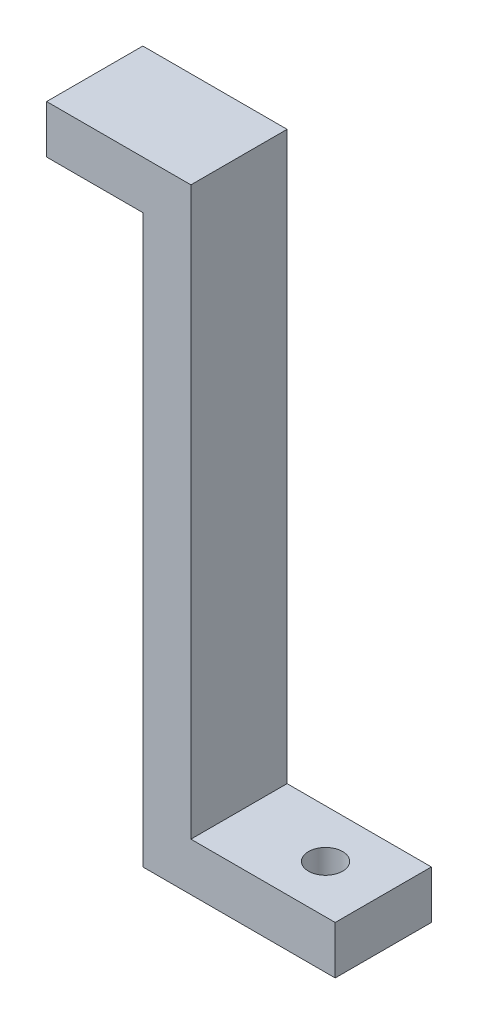
ISO-10303-21;
HEADER;
FILE_DESCRIPTION(('STEP AP214'),'2;1');
FILE_NAME('part.step','',(''),(''),'','','');
FILE_SCHEMA(('AUTOMOTIVE_DESIGN { 1 0 10303 214 1 1 1 1 }'));
ENDSEC;
DATA;
#1=APPLICATION_CONTEXT('core data for automotive mechanical design processes');
#2=APPLICATION_PROTOCOL_DEFINITION('international standard','automotive_design',2000,#1);
#3=PRODUCT_CONTEXT('',#1,'mechanical');
#4=PRODUCT('Part','Part','',(#3));
#5=PRODUCT_RELATED_PRODUCT_CATEGORY('part','',(#4));
#6=PRODUCT_DEFINITION_FORMATION('','',#4);
#7=PRODUCT_DEFINITION_CONTEXT('part definition',#1,'design');
#8=PRODUCT_DEFINITION('design','',#6,#7);
#9=PRODUCT_DEFINITION_SHAPE('','',#8);
#10=(LENGTH_UNIT() NAMED_UNIT(*) SI_UNIT(.MILLI.,.METRE.));
#11=(NAMED_UNIT(*) PLANE_ANGLE_UNIT() SI_UNIT($,.RADIAN.));
#12=(NAMED_UNIT(*) SI_UNIT($,.STERADIAN.) SOLID_ANGLE_UNIT());
#13=UNCERTAINTY_MEASURE_WITH_UNIT(LENGTH_MEASURE(1.E-05),#10,'distance_accuracy_value','');
#14=(GEOMETRIC_REPRESENTATION_CONTEXT(3) GLOBAL_UNCERTAINTY_ASSIGNED_CONTEXT((#13)) GLOBAL_UNIT_ASSIGNED_CONTEXT((#10,
#11,#12)) REPRESENTATION_CONTEXT('',''));
#15=CARTESIAN_POINT('',(0.,0.,0.));
#16=DIRECTION('',(0.,0.,1.));
#17=DIRECTION('',(1.,0.,0.));
#18=AXIS2_PLACEMENT_3D('',#15,#16,#17);
#19=CARTESIAN_POINT('',(-20.,0.,10.));
#20=DIRECTION('',(0.,1.,0.));
#21=DIRECTION('',(0.,0.,1.));
#22=AXIS2_PLACEMENT_3D('',#19,#20,#21);
#23=PLANE('',#22);
#24=CARTESIAN_POINT('',(-6.,0.,5.));
#25=DIRECTION('',(0.,1.,0.));
#26=DIRECTION('',(-1.,0.,0.));
#27=AXIS2_PLACEMENT_3D('',#24,#25,#26);
#28=CIRCLE('',#27,1.775);
#29=CARTESIAN_POINT('',(-7.775,0.,5.));
#30=VERTEX_POINT('',#29);
#31=EDGE_CURVE('E133',#30,#30,#28,.T.);
#32=ORIENTED_EDGE('',*,*,#31,.T.);
#33=EDGE_LOOP('',(#32));
#34=FACE_BOUND('',#33,.T.);
#35=DIRECTION('',(1.,0.,0.));
#36=VECTOR('',#35,1.);
#37=CARTESIAN_POINT('',(-20.,0.,0.));
#38=LINE('',#37,#36);
#39=CARTESIAN_POINT('',(-20.,0.,0.));
#40=VERTEX_POINT('',#39);
#41=CARTESIAN_POINT('',(0.,0.,0.));
#42=VERTEX_POINT('',#41);
#43=EDGE_CURVE('E129',#40,#42,#38,.T.);
#44=ORIENTED_EDGE('',*,*,#43,.T.);
#45=DIRECTION('',(0.,0.,-1.));
#46=VECTOR('',#45,1.);
#47=CARTESIAN_POINT('',(0.,0.,10.));
#48=LINE('',#47,#46);
#49=CARTESIAN_POINT('',(0.,0.,10.));
#50=VERTEX_POINT('',#49);
#51=EDGE_CURVE('E11',#50,#42,#48,.T.);
#52=ORIENTED_EDGE('',*,*,#51,.F.);
#53=DIRECTION('',(1.,0.,0.));
#54=VECTOR('',#53,1.);
#55=CARTESIAN_POINT('',(-20.,0.,10.));
#56=LINE('',#55,#54);
#57=CARTESIAN_POINT('',(-20.,0.,10.));
#58=VERTEX_POINT('',#57);
#59=EDGE_CURVE('E144',#58,#50,#56,.T.);
#60=ORIENTED_EDGE('',*,*,#59,.F.);
#61=DIRECTION('',(0.,0.,-1.));
#62=VECTOR('',#61,1.);
#63=CARTESIAN_POINT('',(-20.,0.,10.));
#64=LINE('',#63,#62);
#65=EDGE_CURVE('E125',#58,#40,#64,.T.);
#66=ORIENTED_EDGE('',*,*,#65,.T.);
#67=EDGE_LOOP('',(#44,#52,#60,#66));
#68=FACE_BOUND('',#67,.T.);
#69=ADVANCED_FACE('F33',(#34,#68),#23,.F.);
#70=CARTESIAN_POINT('',(0.,0.,10.));
#71=DIRECTION('',(-1.,0.,0.));
#72=DIRECTION('',(0.,0.,1.));
#73=AXIS2_PLACEMENT_3D('',#70,#71,#72);
#74=PLANE('',#73);
#75=DIRECTION('',(0.,1.,0.));
#76=VECTOR('',#75,1.);
#77=CARTESIAN_POINT('',(0.,0.,0.));
#78=LINE('',#77,#76);
#79=CARTESIAN_POINT('',(0.,5.,0.));
#80=VERTEX_POINT('',#79);
#81=EDGE_CURVE('E132',#42,#80,#78,.T.);
#82=ORIENTED_EDGE('',*,*,#81,.T.);
#83=DIRECTION('',(0.,0.,-1.));
#84=VECTOR('',#83,1.);
#85=CARTESIAN_POINT('',(0.,5.,10.));
#86=LINE('',#85,#84);
#87=CARTESIAN_POINT('',(0.,5.,10.));
#88=VERTEX_POINT('',#87);
#89=EDGE_CURVE('E41',#88,#80,#86,.T.);
#90=ORIENTED_EDGE('',*,*,#89,.F.);
#91=DIRECTION('',(0.,1.,0.));
#92=VECTOR('',#91,1.);
#93=CARTESIAN_POINT('',(0.,0.,10.));
#94=LINE('',#93,#92);
#95=EDGE_CURVE('E92',#50,#88,#94,.T.);
#96=ORIENTED_EDGE('',*,*,#95,.F.);
#97=ORIENTED_EDGE('',*,*,#51,.T.);
#98=EDGE_LOOP('',(#82,#90,#96,#97));
#99=FACE_BOUND('',#98,.T.);
#100=ADVANCED_FACE('F192',(#99),#74,.F.);
#101=CARTESIAN_POINT('',(0.,5.,10.));
#102=DIRECTION('',(0.,-1.,0.));
#103=DIRECTION('',(1.,0.,0.));
#104=AXIS2_PLACEMENT_3D('',#101,#102,#103);
#105=PLANE('',#104);
#106=CARTESIAN_POINT('',(-6.,5.,5.));
#107=DIRECTION('',(0.,1.,0.));
#108=DIRECTION('',(-1.,0.,0.));
#109=AXIS2_PLACEMENT_3D('',#106,#107,#108);
#110=CIRCLE('',#109,1.775);
#111=CARTESIAN_POINT('',(-7.775,5.,5.));
#112=VERTEX_POINT('',#111);
#113=EDGE_CURVE('E177',#112,#112,#110,.T.);
#114=ORIENTED_EDGE('',*,*,#113,.F.);
#115=EDGE_LOOP('',(#114));
#116=FACE_BOUND('',#115,.T.);
#117=DIRECTION('',(-1.,0.,0.));
#118=VECTOR('',#117,1.);
#119=CARTESIAN_POINT('',(0.,5.,0.));
#120=LINE('',#119,#118);
#121=CARTESIAN_POINT('',(-15.,5.,0.));
#122=VERTEX_POINT('',#121);
#123=EDGE_CURVE('E135',#80,#122,#120,.T.);
#124=ORIENTED_EDGE('',*,*,#123,.T.);
#125=DIRECTION('',(0.,0.,-1.));
#126=VECTOR('',#125,1.);
#127=CARTESIAN_POINT('',(-15.,5.,10.));
#128=LINE('',#127,#126);
#129=CARTESIAN_POINT('',(-15.,5.,10.));
#130=VERTEX_POINT('',#129);
#131=EDGE_CURVE('E151',#130,#122,#128,.T.);
#132=ORIENTED_EDGE('',*,*,#131,.F.);
#133=DIRECTION('',(-1.,0.,0.));
#134=VECTOR('',#133,1.);
#135=CARTESIAN_POINT('',(0.,5.,10.));
#136=LINE('',#135,#134);
#137=EDGE_CURVE('E159',#88,#130,#136,.T.);
#138=ORIENTED_EDGE('',*,*,#137,.F.);
#139=ORIENTED_EDGE('',*,*,#89,.T.);
#140=EDGE_LOOP('',(#124,#132,#138,#139));
#141=FACE_BOUND('',#140,.T.);
#142=ADVANCED_FACE('F157',(#116,#141),#105,.F.);
#143=CARTESIAN_POINT('',(-15.,5.,10.));
#144=DIRECTION('',(-1.,0.,0.));
#145=DIRECTION('',(0.,0.,1.));
#146=AXIS2_PLACEMENT_3D('',#143,#144,#145);
#147=PLANE('',#146);
#148=DIRECTION('',(0.,1.,0.));
#149=VECTOR('',#148,1.);
#150=CARTESIAN_POINT('',(-15.,5.,0.));
#151=LINE('',#150,#149);
#152=CARTESIAN_POINT('',(-15.,63.912,0.));
#153=VERTEX_POINT('',#152);
#154=EDGE_CURVE('E137',#122,#153,#151,.T.);
#155=ORIENTED_EDGE('',*,*,#154,.T.);
#156=DIRECTION('',(0.,0.,-1.));
#157=VECTOR('',#156,1.);
#158=CARTESIAN_POINT('',(-15.,63.912,10.));
#159=LINE('',#158,#157);
#160=CARTESIAN_POINT('',(-15.,63.912,10.));
#161=VERTEX_POINT('',#160);
#162=EDGE_CURVE('E148',#161,#153,#159,.T.);
#163=ORIENTED_EDGE('',*,*,#162,.F.);
#164=DIRECTION('',(0.,1.,0.));
#165=VECTOR('',#164,1.);
#166=CARTESIAN_POINT('',(-15.,5.,10.));
#167=LINE('',#166,#165);
#168=EDGE_CURVE('E171',#130,#161,#167,.T.);
#169=ORIENTED_EDGE('',*,*,#168,.F.);
#170=ORIENTED_EDGE('',*,*,#131,.T.);
#171=EDGE_LOOP('',(#155,#163,#169,#170));
#172=FACE_BOUND('',#171,.T.);
#173=ADVANCED_FACE('F167',(#172),#147,.F.);
#174=CARTESIAN_POINT('',(-15.,63.912,10.));
#175=DIRECTION('',(0.,-1.,0.));
#176=DIRECTION('',(0.,0.,-1.));
#177=AXIS2_PLACEMENT_3D('',#174,#175,#176);
#178=PLANE('',#177);
#179=DIRECTION('',(-1.,0.,0.));
#180=VECTOR('',#179,1.);
#181=CARTESIAN_POINT('',(-15.,63.912,0.));
#182=LINE('',#181,#180);
#183=CARTESIAN_POINT('',(-30.,63.912,0.));
#184=VERTEX_POINT('',#183);
#185=EDGE_CURVE('E139',#153,#184,#182,.T.);
#186=ORIENTED_EDGE('',*,*,#185,.T.);
#187=DIRECTION('',(0.,0.,-1.));
#188=VECTOR('',#187,1.);
#189=CARTESIAN_POINT('',(-30.,63.912,10.));
#190=LINE('',#189,#188);
#191=CARTESIAN_POINT('',(-30.,63.912,10.));
#192=VERTEX_POINT('',#191);
#193=EDGE_CURVE('E120',#192,#184,#190,.T.);
#194=ORIENTED_EDGE('',*,*,#193,.F.);
#195=DIRECTION('',(-1.,0.,0.));
#196=VECTOR('',#195,1.);
#197=CARTESIAN_POINT('',(-15.,63.912,10.));
#198=LINE('',#197,#196);
#199=EDGE_CURVE('E111',#161,#192,#198,.T.);
#200=ORIENTED_EDGE('',*,*,#199,.F.);
#201=ORIENTED_EDGE('',*,*,#162,.T.);
#202=EDGE_LOOP('',(#186,#194,#200,#201));
#203=FACE_BOUND('',#202,.T.);
#204=ADVANCED_FACE('F170',(#203),#178,.F.);
#205=CARTESIAN_POINT('',(-30.,63.912,10.));
#206=DIRECTION('',(1.,0.,0.));
#207=DIRECTION('',(0.,0.,-1.));
#208=AXIS2_PLACEMENT_3D('',#205,#206,#207);
#209=PLANE('',#208);
#210=DIRECTION('',(0.,-1.,0.));
#211=VECTOR('',#210,1.);
#212=CARTESIAN_POINT('',(-30.,63.912,0.));
#213=LINE('',#212,#211);
#214=CARTESIAN_POINT('',(-30.,58.912,0.));
#215=VERTEX_POINT('',#214);
#216=EDGE_CURVE('E119',#184,#215,#213,.T.);
#217=ORIENTED_EDGE('',*,*,#216,.T.);
#218=DIRECTION('',(0.,0.,-1.));
#219=VECTOR('',#218,1.);
#220=CARTESIAN_POINT('',(-30.,58.912,10.));
#221=LINE('',#220,#219);
#222=CARTESIAN_POINT('',(-30.,58.912,10.));
#223=VERTEX_POINT('',#222);
#224=EDGE_CURVE('E116',#223,#215,#221,.T.);
#225=ORIENTED_EDGE('',*,*,#224,.F.);
#226=DIRECTION('',(0.,-1.,0.));
#227=VECTOR('',#226,1.);
#228=CARTESIAN_POINT('',(-30.,63.912,10.));
#229=LINE('',#228,#227);
#230=EDGE_CURVE('E105',#192,#223,#229,.T.);
#231=ORIENTED_EDGE('',*,*,#230,.F.);
#232=ORIENTED_EDGE('',*,*,#193,.T.);
#233=EDGE_LOOP('',(#217,#225,#231,#232));
#234=FACE_BOUND('',#233,.T.);
#235=ADVANCED_FACE('F117',(#234),#209,.F.);
#236=CARTESIAN_POINT('',(-30.,58.912,10.));
#237=DIRECTION('',(0.,1.,0.));
#238=DIRECTION('',(-1.,0.,0.));
#239=AXIS2_PLACEMENT_3D('',#236,#237,#238);
#240=PLANE('',#239);
#241=DIRECTION('',(1.,0.,0.));
#242=VECTOR('',#241,1.);
#243=CARTESIAN_POINT('',(-30.,58.912,0.));
#244=LINE('',#243,#242);
#245=CARTESIAN_POINT('',(-20.,58.912,0.));
#246=VERTEX_POINT('',#245);
#247=EDGE_CURVE('E78',#215,#246,#244,.T.);
#248=ORIENTED_EDGE('',*,*,#247,.T.);
#249=DIRECTION('',(0.,0.,-1.));
#250=VECTOR('',#249,1.);
#251=CARTESIAN_POINT('',(-20.,58.912,10.));
#252=LINE('',#251,#250);
#253=CARTESIAN_POINT('',(-20.,58.912,10.));
#254=VERTEX_POINT('',#253);
#255=EDGE_CURVE('E121',#254,#246,#252,.T.);
#256=ORIENTED_EDGE('',*,*,#255,.F.);
#257=DIRECTION('',(1.,0.,0.));
#258=VECTOR('',#257,1.);
#259=CARTESIAN_POINT('',(-30.,58.912,10.));
#260=LINE('',#259,#258);
#261=EDGE_CURVE('E109',#223,#254,#260,.T.);
#262=ORIENTED_EDGE('',*,*,#261,.F.);
#263=ORIENTED_EDGE('',*,*,#224,.T.);
#264=EDGE_LOOP('',(#248,#256,#262,#263));
#265=FACE_BOUND('',#264,.T.);
#266=ADVANCED_FACE('F123',(#265),#240,.F.);
#267=CARTESIAN_POINT('',(-20.,58.912,10.));
#268=DIRECTION('',(1.,0.,0.));
#269=DIRECTION('',(0.,1.,0.));
#270=AXIS2_PLACEMENT_3D('',#267,#268,#269);
#271=PLANE('',#270);
#272=DIRECTION('',(0.,-1.,0.));
#273=VECTOR('',#272,1.);
#274=CARTESIAN_POINT('',(-20.,58.912,0.));
#275=LINE('',#274,#273);
#276=EDGE_CURVE('E84',#246,#40,#275,.T.);
#277=ORIENTED_EDGE('',*,*,#276,.T.);
#278=ORIENTED_EDGE('',*,*,#65,.F.);
#279=DIRECTION('',(0.,-1.,0.));
#280=VECTOR('',#279,1.);
#281=CARTESIAN_POINT('',(-20.,58.912,10.));
#282=LINE('',#281,#280);
#283=EDGE_CURVE('E49',#254,#58,#282,.T.);
#284=ORIENTED_EDGE('',*,*,#283,.F.);
#285=ORIENTED_EDGE('',*,*,#255,.T.);
#286=EDGE_LOOP('',(#277,#278,#284,#285));
#287=FACE_BOUND('',#286,.T.);
#288=ADVANCED_FACE('F239',(#287),#271,.F.);
#289=CARTESIAN_POINT('',(0.,0.,10.));
#290=DIRECTION('',(0.,0.,1.));
#291=DIRECTION('',(1.,0.,0.));
#292=AXIS2_PLACEMENT_3D('',#289,#290,#291);
#293=PLANE('',#292);
#294=ORIENTED_EDGE('',*,*,#59,.T.);
#295=ORIENTED_EDGE('',*,*,#95,.T.);
#296=ORIENTED_EDGE('',*,*,#137,.T.);
#297=ORIENTED_EDGE('',*,*,#168,.T.);
#298=ORIENTED_EDGE('',*,*,#199,.T.);
#299=ORIENTED_EDGE('',*,*,#230,.T.);
#300=ORIENTED_EDGE('',*,*,#261,.T.);
#301=ORIENTED_EDGE('',*,*,#283,.T.);
#302=EDGE_LOOP('',(#294,#295,#296,#297,#298,#299,#300,#301));
#303=FACE_BOUND('',#302,.T.);
#304=ADVANCED_FACE('F107',(#303),#293,.T.);
#305=CARTESIAN_POINT('',(0.,0.,0.));
#306=DIRECTION('',(0.,0.,1.));
#307=DIRECTION('',(1.,0.,0.));
#308=AXIS2_PLACEMENT_3D('',#305,#306,#307);
#309=PLANE('',#308);
#310=ORIENTED_EDGE('',*,*,#43,.F.);
#311=ORIENTED_EDGE('',*,*,#276,.F.);
#312=ORIENTED_EDGE('',*,*,#247,.F.);
#313=ORIENTED_EDGE('',*,*,#216,.F.);
#314=ORIENTED_EDGE('',*,*,#185,.F.);
#315=ORIENTED_EDGE('',*,*,#154,.F.);
#316=ORIENTED_EDGE('',*,*,#123,.F.);
#317=ORIENTED_EDGE('',*,*,#81,.F.);
#318=EDGE_LOOP('',(#310,#311,#312,#313,#314,#315,#316,#317));
#319=FACE_BOUND('',#318,.T.);
#320=ADVANCED_FACE('F163',(#319),#309,.F.);
#321=CARTESIAN_POINT('',(-6.,0.,5.));
#322=DIRECTION('',(0.,1.,0.));
#323=DIRECTION('',(-1.,0.,0.));
#324=AXIS2_PLACEMENT_3D('',#321,#322,#323);
#325=CYLINDRICAL_SURFACE('',#324,1.775);
#326=ORIENTED_EDGE('',*,*,#31,.F.);
#327=EDGE_LOOP('',(#326));
#328=FACE_BOUND('',#327,.T.);
#329=ORIENTED_EDGE('',*,*,#113,.T.);
#330=EDGE_LOOP('',(#329));
#331=FACE_BOUND('',#330,.T.);
#332=ADVANCED_FACE('F185',(#328,#331),#325,.F.);
#333=CLOSED_SHELL('',(#69,#100,#142,#173,#204,#235,#266,#288,#304,#320,#332));
#334=MANIFOLD_SOLID_BREP('B2',#333);
#335=ADVANCED_BREP_SHAPE_REPRESENTATION('',(#18,#334),#14);
#336=SHAPE_DEFINITION_REPRESENTATION(#9,#335);
ENDSEC;
END-ISO-10303-21;
